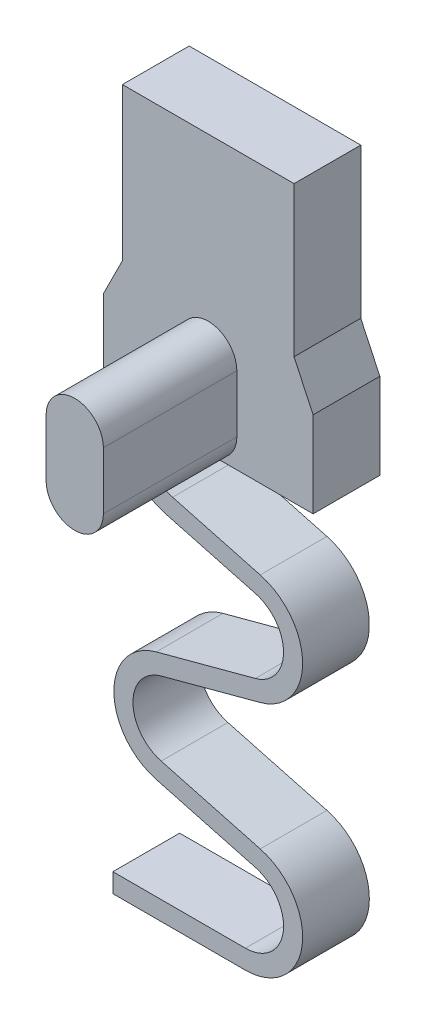
ISO-10303-21;
HEADER;
FILE_DESCRIPTION(('STEP AP214'),'2;1');
FILE_NAME('part.step','',(''),(''),'','','');
FILE_SCHEMA(('AUTOMOTIVE_DESIGN { 1 0 10303 214 1 1 1 1 }'));
ENDSEC;
DATA;
#1=APPLICATION_CONTEXT('core data for automotive mechanical design processes');
#2=APPLICATION_PROTOCOL_DEFINITION('international standard','automotive_design',2000,#1);
#3=PRODUCT_CONTEXT('',#1,'mechanical');
#4=PRODUCT('Part','Part','',(#3));
#5=PRODUCT_RELATED_PRODUCT_CATEGORY('part','',(#4));
#6=PRODUCT_DEFINITION_FORMATION('','',#4);
#7=PRODUCT_DEFINITION_CONTEXT('part definition',#1,'design');
#8=PRODUCT_DEFINITION('design','',#6,#7);
#9=PRODUCT_DEFINITION_SHAPE('','',#8);
#10=(LENGTH_UNIT() NAMED_UNIT(*) SI_UNIT(.MILLI.,.METRE.));
#11=(NAMED_UNIT(*) PLANE_ANGLE_UNIT() SI_UNIT($,.RADIAN.));
#12=(NAMED_UNIT(*) SI_UNIT($,.STERADIAN.) SOLID_ANGLE_UNIT());
#13=UNCERTAINTY_MEASURE_WITH_UNIT(LENGTH_MEASURE(1.E-05),#10,'distance_accuracy_value','');
#14=(GEOMETRIC_REPRESENTATION_CONTEXT(3) GLOBAL_UNCERTAINTY_ASSIGNED_CONTEXT((#13)) GLOBAL_UNIT_ASSIGNED_CONTEXT((#10,
#11,#12)) REPRESENTATION_CONTEXT('',''));
#15=CARTESIAN_POINT('',(0.,0.,0.));
#16=DIRECTION('',(0.,0.,1.));
#17=DIRECTION('',(1.,0.,0.));
#18=AXIS2_PLACEMENT_3D('',#15,#16,#17);
#19=CARTESIAN_POINT('',(8.11763809020503,16.8746171576417,3.5));
#20=DIRECTION('',(-0.258819045102513,-0.96592582628907,0.));
#21=DIRECTION('',(0.965925826289071,-0.258819045102513,0.));
#22=AXIS2_PLACEMENT_3D('',#19,#20,#21);
#23=PLANE('',#22);
#24=DIRECTION('',(-0.96592582628907,0.258819045102513,0.));
#25=VECTOR('',#24,1.);
#26=CARTESIAN_POINT('',(8.11763809020503,16.8746171576417,0.));
#27=LINE('',#26,#25);
#28=CARTESIAN_POINT('',(8.11763809020503,16.8746171576417,0.));
#29=VERTEX_POINT('',#28);
#30=CARTESIAN_POINT('',(3.52152608796797,18.1061416569641,0.));
#31=VERTEX_POINT('',#30);
#32=EDGE_CURVE('E538',#29,#31,#27,.T.);
#33=ORIENTED_EDGE('',*,*,#32,.F.);
#34=DIRECTION('',(0.,0.,-1.));
#35=VECTOR('',#34,1.);
#36=CARTESIAN_POINT('',(8.11763809020503,16.8746171576417,3.5));
#37=LINE('',#36,#35);
#38=CARTESIAN_POINT('',(8.11763809020503,16.8746171576417,3.5));
#39=VERTEX_POINT('',#38);
#40=EDGE_CURVE('E633',#39,#29,#37,.T.);
#41=ORIENTED_EDGE('',*,*,#40,.F.);
#42=DIRECTION('',(-0.96592582628907,0.258819045102513,0.));
#43=VECTOR('',#42,1.);
#44=CARTESIAN_POINT('',(8.11763809020503,16.8746171576417,3.5));
#45=LINE('',#44,#43);
#46=CARTESIAN_POINT('',(3.52152608796797,18.1061416569641,3.5));
#47=VERTEX_POINT('',#46);
#48=EDGE_CURVE('E477',#39,#47,#45,.T.);
#49=ORIENTED_EDGE('',*,*,#48,.T.);
#50=DIRECTION('',(0.,0.,-1.));
#51=VECTOR('',#50,1.);
#52=CARTESIAN_POINT('',(3.52152608796797,18.1061416569641,3.5));
#53=LINE('',#52,#51);
#54=EDGE_CURVE('E358',#47,#31,#53,.T.);
#55=ORIENTED_EDGE('',*,*,#54,.T.);
#56=EDGE_LOOP('',(#33,#41,#49,#55));
#57=FACE_BOUND('',#56,.T.);
#58=ADVANCED_FACE('F94',(#57),#23,.T.);
#59=CARTESIAN_POINT('',(7.59999999999998,14.9427655050636,3.5));
#60=DIRECTION('',(0.,0.,-1.));
#61=DIRECTION('',(-1.,0.,0.));
#62=AXIS2_PLACEMENT_3D('',#59,#60,#61);
#63=CYLINDRICAL_SURFACE('',#62,2.00000000000003);
#64=CARTESIAN_POINT('',(7.59999999999998,14.9427655050636,0.));
#65=DIRECTION('',(0.,0.,1.));
#66=DIRECTION('',(1.,0.,0.));
#67=AXIS2_PLACEMENT_3D('',#64,#65,#66);
#68=CIRCLE('',#67,2.00000000000003);
#69=CARTESIAN_POINT('',(8.11763809020503,13.0109138524854,0.));
#70=VERTEX_POINT('',#69);
#71=EDGE_CURVE('E542',#70,#29,#68,.T.);
#72=ORIENTED_EDGE('',*,*,#71,.F.);
#73=DIRECTION('',(0.,0.,-1.));
#74=VECTOR('',#73,1.);
#75=CARTESIAN_POINT('',(8.11763809020503,13.0109138524854,3.5));
#76=LINE('',#75,#74);
#77=CARTESIAN_POINT('',(8.11763809020503,13.0109138524854,3.5));
#78=VERTEX_POINT('',#77);
#79=EDGE_CURVE('E630',#78,#70,#76,.T.);
#80=ORIENTED_EDGE('',*,*,#79,.F.);
#81=CARTESIAN_POINT('',(7.59999999999998,14.9427655050636,3.5));
#82=DIRECTION('',(0.,0.,1.));
#83=DIRECTION('',(1.,0.,0.));
#84=AXIS2_PLACEMENT_3D('',#81,#82,#83);
#85=CIRCLE('',#84,2.00000000000003);
#86=EDGE_CURVE('E486',#78,#39,#85,.T.);
#87=ORIENTED_EDGE('',*,*,#86,.T.);
#88=ORIENTED_EDGE('',*,*,#40,.T.);
#89=EDGE_LOOP('',(#72,#80,#87,#88));
#90=FACE_BOUND('',#89,.T.);
#91=ADVANCED_FACE('F678',(#90),#63,.F.);
#92=CARTESIAN_POINT('',(2.92354286469244,11.619160231399,3.5));
#93=DIRECTION('',(-0.258819045102522,0.965925826289068,0.));
#94=DIRECTION('',(-0.965925826289068,-0.258819045102522,0.));
#95=AXIS2_PLACEMENT_3D('',#92,#93,#94);
#96=PLANE('',#95);
#97=DIRECTION('',(0.965925826289068,0.258819045102522,0.));
#98=VECTOR('',#97,1.);
#99=CARTESIAN_POINT('',(2.92354286469244,11.619160231399,0.));
#100=LINE('',#99,#98);
#101=CARTESIAN_POINT('',(2.92354286469244,11.619160231399,0.));
#102=VERTEX_POINT('',#101);
#103=EDGE_CURVE('E546',#102,#70,#100,.T.);
#104=ORIENTED_EDGE('',*,*,#103,.F.);
#105=DIRECTION('',(0.,0.,-1.));
#106=VECTOR('',#105,1.);
#107=CARTESIAN_POINT('',(2.92354286469244,11.619160231399,3.5));
#108=LINE('',#107,#106);
#109=CARTESIAN_POINT('',(2.92354286469244,11.619160231399,3.5));
#110=VERTEX_POINT('',#109);
#111=EDGE_CURVE('E627',#110,#102,#108,.T.);
#112=ORIENTED_EDGE('',*,*,#111,.F.);
#113=DIRECTION('',(0.965925826289068,0.258819045102522,0.));
#114=VECTOR('',#113,1.);
#115=CARTESIAN_POINT('',(2.92354286469244,11.619160231399,3.5));
#116=LINE('',#115,#114);
#117=EDGE_CURVE('E489',#110,#78,#116,.T.);
#118=ORIENTED_EDGE('',*,*,#117,.T.);
#119=ORIENTED_EDGE('',*,*,#79,.T.);
#120=EDGE_LOOP('',(#104,#112,#118,#119));
#121=FACE_BOUND('',#120,.T.);
#122=ADVANCED_FACE('F684',(#121),#96,.T.);
#123=CARTESIAN_POINT('',(3.7,8.72138275253176,3.5));
#124=DIRECTION('',(0.,0.,-1.));
#125=DIRECTION('',(-1.,0.,0.));
#126=AXIS2_PLACEMENT_3D('',#123,#124,#125);
#127=CYLINDRICAL_SURFACE('',#126,3.);
#128=CARTESIAN_POINT('',(3.7,8.72138275253176,0.));
#129=DIRECTION('',(0.,0.,1.));
#130=DIRECTION('',(1.,0.,0.));
#131=AXIS2_PLACEMENT_3D('',#128,#129,#130);
#132=CIRCLE('',#131,3.);
#133=CARTESIAN_POINT('',(2.92354286469246,5.82360527366455,0.));
#134=VERTEX_POINT('',#133);
#135=EDGE_CURVE('E550',#134,#102,#132,.F.);
#136=ORIENTED_EDGE('',*,*,#135,.F.);
#137=DIRECTION('',(0.,0.,-1.));
#138=VECTOR('',#137,1.);
#139=CARTESIAN_POINT('',(2.92354286469246,5.82360527366455,3.5));
#140=LINE('',#139,#138);
#141=CARTESIAN_POINT('',(2.92354286469246,5.82360527366455,3.5));
#142=VERTEX_POINT('',#141);
#143=EDGE_CURVE('E624',#142,#134,#140,.T.);
#144=ORIENTED_EDGE('',*,*,#143,.F.);
#145=CARTESIAN_POINT('',(3.7,8.72138275253176,3.5));
#146=DIRECTION('',(0.,0.,1.));
#147=DIRECTION('',(1.,0.,0.));
#148=AXIS2_PLACEMENT_3D('',#145,#146,#147);
#149=CIRCLE('',#148,3.);
#150=EDGE_CURVE('E492',#142,#110,#149,.F.);
#151=ORIENTED_EDGE('',*,*,#150,.T.);
#152=ORIENTED_EDGE('',*,*,#111,.T.);
#153=EDGE_LOOP('',(#136,#144,#151,#152));
#154=FACE_BOUND('',#153,.T.);
#155=ADVANCED_FACE('F810',(#154),#127,.T.);
#156=CARTESIAN_POINT('',(8.11763809020503,4.43185165257814,3.5));
#157=DIRECTION('',(-0.258819045102514,-0.96592582628907,0.));
#158=DIRECTION('',(0.96592582628907,-0.258819045102514,0.));
#159=AXIS2_PLACEMENT_3D('',#156,#157,#158);
#160=PLANE('',#159);
#161=DIRECTION('',(-0.96592582628907,0.258819045102514,0.));
#162=VECTOR('',#161,1.);
#163=CARTESIAN_POINT('',(8.11763809020503,4.43185165257814,0.));
#164=LINE('',#163,#162);
#165=CARTESIAN_POINT('',(8.11763809020503,4.43185165257814,0.));
#166=VERTEX_POINT('',#165);
#167=EDGE_CURVE('E554',#166,#134,#164,.T.);
#168=ORIENTED_EDGE('',*,*,#167,.F.);
#169=DIRECTION('',(0.,0.,-1.));
#170=VECTOR('',#169,1.);
#171=CARTESIAN_POINT('',(8.11763809020503,4.43185165257814,3.5));
#172=LINE('',#171,#170);
#173=CARTESIAN_POINT('',(8.11763809020503,4.43185165257814,3.5));
#174=VERTEX_POINT('',#173);
#175=EDGE_CURVE('E621',#174,#166,#172,.T.);
#176=ORIENTED_EDGE('',*,*,#175,.F.);
#177=DIRECTION('',(-0.96592582628907,0.258819045102514,0.));
#178=VECTOR('',#177,1.);
#179=CARTESIAN_POINT('',(8.11763809020503,4.43185165257814,3.5));
#180=LINE('',#179,#178);
#181=EDGE_CURVE('E496',#174,#142,#180,.T.);
#182=ORIENTED_EDGE('',*,*,#181,.T.);
#183=ORIENTED_EDGE('',*,*,#143,.T.);
#184=EDGE_LOOP('',(#168,#176,#182,#183));
#185=FACE_BOUND('',#184,.T.);
#186=ADVANCED_FACE('F803',(#185),#160,.T.);
#187=CARTESIAN_POINT('',(7.6,2.5,3.5));
#188=DIRECTION('',(0.,0.,-1.));
#189=DIRECTION('',(-1.,0.,0.));
#190=AXIS2_PLACEMENT_3D('',#187,#188,#189);
#191=CYLINDRICAL_SURFACE('',#190,2.);
#192=CARTESIAN_POINT('',(7.6,2.5,0.));
#193=DIRECTION('',(0.,0.,1.));
#194=DIRECTION('',(1.,0.,0.));
#195=AXIS2_PLACEMENT_3D('',#192,#193,#194);
#196=CIRCLE('',#195,2.);
#197=CARTESIAN_POINT('',(7.6,0.5,0.));
#198=VERTEX_POINT('',#197);
#199=EDGE_CURVE('E558',#198,#166,#196,.T.);
#200=ORIENTED_EDGE('',*,*,#199,.F.);
#201=DIRECTION('',(0.,0.,-1.));
#202=VECTOR('',#201,1.);
#203=CARTESIAN_POINT('',(7.6,0.5,3.5));
#204=LINE('',#203,#202);
#205=CARTESIAN_POINT('',(7.6,0.5,3.5));
#206=VERTEX_POINT('',#205);
#207=EDGE_CURVE('E618',#206,#198,#204,.T.);
#208=ORIENTED_EDGE('',*,*,#207,.F.);
#209=CARTESIAN_POINT('',(7.6,2.5,3.5));
#210=DIRECTION('',(0.,0.,1.));
#211=DIRECTION('',(1.,0.,0.));
#212=AXIS2_PLACEMENT_3D('',#209,#210,#211);
#213=CIRCLE('',#212,2.);
#214=EDGE_CURVE('E500',#206,#174,#213,.T.);
#215=ORIENTED_EDGE('',*,*,#214,.T.);
#216=ORIENTED_EDGE('',*,*,#175,.T.);
#217=EDGE_LOOP('',(#200,#208,#215,#216));
#218=FACE_BOUND('',#217,.T.);
#219=ADVANCED_FACE('F796',(#218),#191,.F.);
#220=CARTESIAN_POINT('',(0.65,0.5,3.5));
#221=DIRECTION('',(0.,1.,0.));
#222=DIRECTION('',(0.,0.,1.));
#223=AXIS2_PLACEMENT_3D('',#220,#221,#222);
#224=PLANE('',#223);
#225=DIRECTION('',(1.,0.,0.));
#226=VECTOR('',#225,1.);
#227=CARTESIAN_POINT('',(0.65,0.5,0.));
#228=LINE('',#227,#226);
#229=CARTESIAN_POINT('',(0.65,0.5,0.));
#230=VERTEX_POINT('',#229);
#231=EDGE_CURVE('E562',#230,#198,#228,.T.);
#232=ORIENTED_EDGE('',*,*,#231,.F.);
#233=DIRECTION('',(0.,0.,-1.));
#234=VECTOR('',#233,1.);
#235=CARTESIAN_POINT('',(0.65,0.5,3.5));
#236=LINE('',#235,#234);
#237=CARTESIAN_POINT('',(0.65,0.5,3.5));
#238=VERTEX_POINT('',#237);
#239=EDGE_CURVE('E615',#238,#230,#236,.T.);
#240=ORIENTED_EDGE('',*,*,#239,.F.);
#241=DIRECTION('',(1.,0.,0.));
#242=VECTOR('',#241,1.);
#243=CARTESIAN_POINT('',(0.65,0.5,3.5));
#244=LINE('',#243,#242);
#245=EDGE_CURVE('E504',#238,#206,#244,.T.);
#246=ORIENTED_EDGE('',*,*,#245,.T.);
#247=ORIENTED_EDGE('',*,*,#207,.T.);
#248=EDGE_LOOP('',(#232,#240,#246,#247));
#249=FACE_BOUND('',#248,.T.);
#250=ADVANCED_FACE('F789',(#249),#224,.T.);
#251=CARTESIAN_POINT('',(0.65,-0.5,3.5));
#252=DIRECTION('',(-1.,0.,0.));
#253=DIRECTION('',(0.,0.,1.));
#254=AXIS2_PLACEMENT_3D('',#251,#252,#253);
#255=PLANE('',#254);
#256=DIRECTION('',(0.,1.,0.));
#257=VECTOR('',#256,1.);
#258=CARTESIAN_POINT('',(0.65,-0.5,0.));
#259=LINE('',#258,#257);
#260=CARTESIAN_POINT('',(0.65,-0.5,0.));
#261=VERTEX_POINT('',#260);
#262=EDGE_CURVE('E566',#261,#230,#259,.T.);
#263=ORIENTED_EDGE('',*,*,#262,.F.);
#264=DIRECTION('',(0.,0.,-1.));
#265=VECTOR('',#264,1.);
#266=CARTESIAN_POINT('',(0.65,-0.5,3.5));
#267=LINE('',#266,#265);
#268=CARTESIAN_POINT('',(0.65,-0.5,3.5));
#269=VERTEX_POINT('',#268);
#270=EDGE_CURVE('E612',#269,#261,#267,.T.);
#271=ORIENTED_EDGE('',*,*,#270,.F.);
#272=DIRECTION('',(0.,1.,0.));
#273=VECTOR('',#272,1.);
#274=CARTESIAN_POINT('',(0.65,-0.5,3.5));
#275=LINE('',#274,#273);
#276=EDGE_CURVE('E508',#269,#238,#275,.T.);
#277=ORIENTED_EDGE('',*,*,#276,.T.);
#278=ORIENTED_EDGE('',*,*,#239,.T.);
#279=EDGE_LOOP('',(#263,#271,#277,#278));
#280=FACE_BOUND('',#279,.T.);
#281=ADVANCED_FACE('F782',(#280),#255,.T.);
#282=CARTESIAN_POINT('',(0.65,-0.5,3.5));
#283=DIRECTION('',(0.,1.,0.));
#284=DIRECTION('',(0.,0.,1.));
#285=AXIS2_PLACEMENT_3D('',#282,#283,#284);
#286=PLANE('',#285);
#287=DIRECTION('',(1.,0.,0.));
#288=VECTOR('',#287,1.);
#289=CARTESIAN_POINT('',(0.65,-0.5,0.));
#290=LINE('',#289,#288);
#291=CARTESIAN_POINT('',(7.6,-0.5,0.));
#292=VERTEX_POINT('',#291);
#293=EDGE_CURVE('E570',#261,#292,#290,.T.);
#294=ORIENTED_EDGE('',*,*,#293,.T.);
#295=DIRECTION('',(0.,0.,-1.));
#296=VECTOR('',#295,1.);
#297=CARTESIAN_POINT('',(7.6,-0.5,3.5));
#298=LINE('',#297,#296);
#299=CARTESIAN_POINT('',(7.6,-0.5,3.5));
#300=VERTEX_POINT('',#299);
#301=EDGE_CURVE('E608',#300,#292,#298,.T.);
#302=ORIENTED_EDGE('',*,*,#301,.F.);
#303=DIRECTION('',(1.,0.,0.));
#304=VECTOR('',#303,1.);
#305=CARTESIAN_POINT('',(0.65,-0.5,3.5));
#306=LINE('',#305,#304);
#307=EDGE_CURVE('E512',#269,#300,#306,.T.);
#308=ORIENTED_EDGE('',*,*,#307,.F.);
#309=ORIENTED_EDGE('',*,*,#270,.T.);
#310=EDGE_LOOP('',(#294,#302,#308,#309));
#311=FACE_BOUND('',#310,.T.);
#312=ADVANCED_FACE('F775',(#311),#286,.F.);
#313=CARTESIAN_POINT('',(7.6,2.5,3.5));
#314=DIRECTION('',(0.,0.,-1.));
#315=DIRECTION('',(-1.,0.,0.));
#316=AXIS2_PLACEMENT_3D('',#313,#314,#315);
#317=CYLINDRICAL_SURFACE('',#316,3.);
#318=CARTESIAN_POINT('',(7.6,2.5,0.));
#319=DIRECTION('',(0.,0.,1.));
#320=DIRECTION('',(1.,0.,0.));
#321=AXIS2_PLACEMENT_3D('',#318,#319,#320);
#322=CIRCLE('',#321,3.);
#323=CARTESIAN_POINT('',(8.37645713530755,5.39777747886721,0.));
#324=VERTEX_POINT('',#323);
#325=EDGE_CURVE('E573',#292,#324,#322,.T.);
#326=ORIENTED_EDGE('',*,*,#325,.T.);
#327=DIRECTION('',(0.,0.,-1.));
#328=VECTOR('',#327,1.);
#329=CARTESIAN_POINT('',(8.37645713530755,5.39777747886721,3.5));
#330=LINE('',#329,#328);
#331=CARTESIAN_POINT('',(8.37645713530755,5.39777747886721,3.5));
#332=VERTEX_POINT('',#331);
#333=EDGE_CURVE('E604',#332,#324,#330,.T.);
#334=ORIENTED_EDGE('',*,*,#333,.F.);
#335=CARTESIAN_POINT('',(7.6,2.5,3.5));
#336=DIRECTION('',(0.,0.,1.));
#337=DIRECTION('',(1.,0.,0.));
#338=AXIS2_PLACEMENT_3D('',#335,#336,#337);
#339=CIRCLE('',#338,3.);
#340=EDGE_CURVE('E515',#300,#332,#339,.T.);
#341=ORIENTED_EDGE('',*,*,#340,.F.);
#342=ORIENTED_EDGE('',*,*,#301,.T.);
#343=EDGE_LOOP('',(#326,#334,#341,#342));
#344=FACE_BOUND('',#343,.T.);
#345=ADVANCED_FACE('F768',(#344),#317,.T.);
#346=CARTESIAN_POINT('',(8.37645713530755,5.39777747886721,3.5));
#347=DIRECTION('',(-0.258819045102514,-0.96592582628907,0.));
#348=DIRECTION('',(0.96592582628907,-0.258819045102514,0.));
#349=AXIS2_PLACEMENT_3D('',#346,#347,#348);
#350=PLANE('',#349);
#351=DIRECTION('',(-0.96592582628907,0.258819045102514,0.));
#352=VECTOR('',#351,1.);
#353=CARTESIAN_POINT('',(8.37645713530755,5.39777747886721,0.));
#354=LINE('',#353,#352);
#355=CARTESIAN_POINT('',(3.18236190979497,6.78953109995362,0.));
#356=VERTEX_POINT('',#355);
#357=EDGE_CURVE('E575',#324,#356,#354,.T.);
#358=ORIENTED_EDGE('',*,*,#357,.T.);
#359=DIRECTION('',(0.,0.,-1.));
#360=VECTOR('',#359,1.);
#361=CARTESIAN_POINT('',(3.18236190979497,6.78953109995362,3.5));
#362=LINE('',#361,#360);
#363=CARTESIAN_POINT('',(3.18236190979497,6.78953109995362,3.5));
#364=VERTEX_POINT('',#363);
#365=EDGE_CURVE('E600',#364,#356,#362,.T.);
#366=ORIENTED_EDGE('',*,*,#365,.F.);
#367=DIRECTION('',(-0.96592582628907,0.258819045102514,0.));
#368=VECTOR('',#367,1.);
#369=CARTESIAN_POINT('',(8.37645713530755,5.39777747886721,3.5));
#370=LINE('',#369,#368);
#371=EDGE_CURVE('E518',#332,#364,#370,.T.);
#372=ORIENTED_EDGE('',*,*,#371,.F.);
#373=ORIENTED_EDGE('',*,*,#333,.T.);
#374=EDGE_LOOP('',(#358,#366,#372,#373));
#375=FACE_BOUND('',#374,.T.);
#376=ADVANCED_FACE('F761',(#375),#350,.F.);
#377=CARTESIAN_POINT('',(3.7,8.72138275253176,3.5));
#378=DIRECTION('',(0.,0.,-1.));
#379=DIRECTION('',(-1.,0.,0.));
#380=AXIS2_PLACEMENT_3D('',#377,#378,#379);
#381=CYLINDRICAL_SURFACE('',#380,2.);
#382=CARTESIAN_POINT('',(3.7,8.72138275253176,0.));
#383=DIRECTION('',(0.,0.,1.));
#384=DIRECTION('',(1.,0.,0.));
#385=AXIS2_PLACEMENT_3D('',#382,#383,#384);
#386=CIRCLE('',#385,2.);
#387=CARTESIAN_POINT('',(3.18236190979496,10.6532344051099,0.));
#388=VERTEX_POINT('',#387);
#389=EDGE_CURVE('E578',#356,#388,#386,.F.);
#390=ORIENTED_EDGE('',*,*,#389,.T.);
#391=DIRECTION('',(0.,0.,-1.));
#392=VECTOR('',#391,1.);
#393=CARTESIAN_POINT('',(3.18236190979496,10.6532344051099,3.5));
#394=LINE('',#393,#392);
#395=CARTESIAN_POINT('',(3.18236190979496,10.6532344051099,3.5));
#396=VERTEX_POINT('',#395);
#397=EDGE_CURVE('E596',#396,#388,#394,.T.);
#398=ORIENTED_EDGE('',*,*,#397,.F.);
#399=CARTESIAN_POINT('',(3.7,8.72138275253176,3.5));
#400=DIRECTION('',(0.,0.,1.));
#401=DIRECTION('',(1.,0.,0.));
#402=AXIS2_PLACEMENT_3D('',#399,#400,#401);
#403=CIRCLE('',#402,2.);
#404=EDGE_CURVE('E521',#364,#396,#403,.F.);
#405=ORIENTED_EDGE('',*,*,#404,.F.);
#406=ORIENTED_EDGE('',*,*,#365,.T.);
#407=EDGE_LOOP('',(#390,#398,#405,#406));
#408=FACE_BOUND('',#407,.T.);
#409=ADVANCED_FACE('F754',(#408),#381,.F.);
#410=CARTESIAN_POINT('',(3.18236190979496,10.6532344051099,3.5));
#411=DIRECTION('',(-0.258819045102522,0.965925826289068,0.));
#412=DIRECTION('',(-0.965925826289068,-0.258819045102522,0.));
#413=AXIS2_PLACEMENT_3D('',#410,#411,#412);
#414=PLANE('',#413);
#415=DIRECTION('',(0.965925826289068,0.258819045102522,0.));
#416=VECTOR('',#415,1.);
#417=CARTESIAN_POINT('',(3.18236190979496,10.6532344051099,0.));
#418=LINE('',#417,#416);
#419=CARTESIAN_POINT('',(8.37645713530755,12.0449880261963,0.));
#420=VERTEX_POINT('',#419);
#421=EDGE_CURVE('E581',#388,#420,#418,.T.);
#422=ORIENTED_EDGE('',*,*,#421,.T.);
#423=DIRECTION('',(0.,0.,-1.));
#424=VECTOR('',#423,1.);
#425=CARTESIAN_POINT('',(8.37645713530755,12.0449880261963,3.5));
#426=LINE('',#425,#424);
#427=CARTESIAN_POINT('',(8.37645713530755,12.0449880261963,3.5));
#428=VERTEX_POINT('',#427);
#429=EDGE_CURVE('E592',#428,#420,#426,.T.);
#430=ORIENTED_EDGE('',*,*,#429,.F.);
#431=DIRECTION('',(0.965925826289068,0.258819045102522,0.));
#432=VECTOR('',#431,1.);
#433=CARTESIAN_POINT('',(3.18236190979496,10.6532344051099,3.5));
#434=LINE('',#433,#432);
#435=EDGE_CURVE('E524',#396,#428,#434,.T.);
#436=ORIENTED_EDGE('',*,*,#435,.F.);
#437=ORIENTED_EDGE('',*,*,#397,.T.);
#438=EDGE_LOOP('',(#422,#430,#436,#437));
#439=FACE_BOUND('',#438,.T.);
#440=ADVANCED_FACE('F747',(#439),#414,.F.);
#441=CARTESIAN_POINT('',(7.59999999999998,14.9427655050636,3.5));
#442=DIRECTION('',(0.,0.,-1.));
#443=DIRECTION('',(-1.,0.,0.));
#444=AXIS2_PLACEMENT_3D('',#441,#442,#443);
#445=CYLINDRICAL_SURFACE('',#444,3.00000000000003);
#446=CARTESIAN_POINT('',(7.59999999999998,14.9427655050636,0.));
#447=DIRECTION('',(0.,0.,1.));
#448=DIRECTION('',(1.,0.,0.));
#449=AXIS2_PLACEMENT_3D('',#446,#447,#448);
#450=CIRCLE('',#449,3.00000000000003);
#451=CARTESIAN_POINT('',(8.37645713530754,17.8405429839308,0.));
#452=VERTEX_POINT('',#451);
#453=EDGE_CURVE('E479',#420,#452,#450,.T.);
#454=ORIENTED_EDGE('',*,*,#453,.T.);
#455=DIRECTION('',(0.,0.,-1.));
#456=VECTOR('',#455,1.);
#457=CARTESIAN_POINT('',(8.37645713530754,17.8405429839308,3.5));
#458=LINE('',#457,#456);
#459=CARTESIAN_POINT('',(8.37645713530754,17.8405429839308,3.5));
#460=VERTEX_POINT('',#459);
#461=EDGE_CURVE('E588',#460,#452,#458,.T.);
#462=ORIENTED_EDGE('',*,*,#461,.F.);
#463=CARTESIAN_POINT('',(7.59999999999998,14.9427655050636,3.5));
#464=DIRECTION('',(0.,0.,1.));
#465=DIRECTION('',(1.,0.,0.));
#466=AXIS2_PLACEMENT_3D('',#463,#464,#465);
#467=CIRCLE('',#466,3.00000000000003);
#468=EDGE_CURVE('E527',#428,#460,#467,.T.);
#469=ORIENTED_EDGE('',*,*,#468,.F.);
#470=ORIENTED_EDGE('',*,*,#429,.T.);
#471=EDGE_LOOP('',(#454,#462,#469,#470));
#472=FACE_BOUND('',#471,.T.);
#473=ADVANCED_FACE('F740',(#472),#445,.T.);
#474=CARTESIAN_POINT('',(8.37645713530754,17.8405429839308,3.5));
#475=DIRECTION('',(-0.258819045102513,-0.96592582628907,0.));
#476=DIRECTION('',(0.965925826289071,-0.258819045102513,0.));
#477=AXIS2_PLACEMENT_3D('',#474,#475,#476);
#478=PLANE('',#477);
#479=DIRECTION('',(-0.96592582628907,0.258819045102513,0.));
#480=VECTOR('',#479,1.);
#481=CARTESIAN_POINT('',(8.37645713530754,17.8405429839308,0.));
#482=LINE('',#481,#480);
#483=CARTESIAN_POINT('',(3.78034513307048,19.0720674832532,0.));
#484=VERTEX_POINT('',#483);
#485=EDGE_CURVE('E473',#452,#484,#482,.T.);
#486=ORIENTED_EDGE('',*,*,#485,.T.);
#487=DIRECTION('',(0.,0.,-1.));
#488=VECTOR('',#487,1.);
#489=CARTESIAN_POINT('',(3.78034513307048,19.0720674832532,3.5));
#490=LINE('',#489,#488);
#491=CARTESIAN_POINT('',(3.78034513307048,19.0720674832532,3.5));
#492=VERTEX_POINT('',#491);
#493=EDGE_CURVE('E532',#492,#484,#490,.T.);
#494=ORIENTED_EDGE('',*,*,#493,.F.);
#495=DIRECTION('',(-0.96592582628907,0.258819045102513,0.));
#496=VECTOR('',#495,1.);
#497=CARTESIAN_POINT('',(8.37645713530754,17.8405429839308,3.5));
#498=LINE('',#497,#496);
#499=EDGE_CURVE('E469',#460,#492,#498,.T.);
#500=ORIENTED_EDGE('',*,*,#499,.F.);
#501=ORIENTED_EDGE('',*,*,#461,.T.);
#502=EDGE_LOOP('',(#486,#494,#500,#501));
#503=FACE_BOUND('',#502,.T.);
#504=ADVANCED_FACE('F696',(#503),#478,.F.);
#505=CARTESIAN_POINT('',(4.69885688264115,22.5,3.5));
#506=DIRECTION('',(0.,0.,-1.));
#507=DIRECTION('',(-1.,0.,0.));
#508=AXIS2_PLACEMENT_3D('',#505,#506,#507);
#509=CYLINDRICAL_SURFACE('',#508,3.54885688264116);
#510=CARTESIAN_POINT('',(4.69885688264115,22.5,0.));
#511=DIRECTION('',(0.,0.,1.));
#512=DIRECTION('',(1.,0.,0.));
#513=AXIS2_PLACEMENT_3D('',#510,#511,#512);
#514=CIRCLE('',#513,3.54885688264116);
#515=CARTESIAN_POINT('',(1.18539915933359,22.,0.));
#516=VERTEX_POINT('',#515);
#517=EDGE_CURVE('E350',#484,#516,#514,.F.);
#518=ORIENTED_EDGE('',*,*,#517,.T.);
#519=DIRECTION('',(0.,0.,-1.));
#520=VECTOR('',#519,1.);
#521=CARTESIAN_POINT('',(1.18539915933359,22.,3.5));
#522=LINE('',#521,#520);
#523=CARTESIAN_POINT('',(1.18539915933359,22.,3.5));
#524=VERTEX_POINT('',#523);
#525=EDGE_CURVE('E357',#516,#524,#522,.F.);
#526=ORIENTED_EDGE('',*,*,#525,.T.);
#527=CARTESIAN_POINT('',(4.69885688264115,22.5,3.5));
#528=DIRECTION('',(0.,0.,1.));
#529=DIRECTION('',(1.,0.,0.));
#530=AXIS2_PLACEMENT_3D('',#527,#528,#529);
#531=CIRCLE('',#530,3.54885688264116);
#532=EDGE_CURVE('E467',#492,#524,#531,.F.);
#533=ORIENTED_EDGE('',*,*,#532,.F.);
#534=ORIENTED_EDGE('',*,*,#493,.T.);
#535=EDGE_LOOP('',(#518,#526,#533,#534));
#536=FACE_BOUND('',#535,.T.);
#537=ADVANCED_FACE('F465',(#536),#509,.F.);
#538=CARTESIAN_POINT('',(4.69885688264115,22.5,3.5));
#539=DIRECTION('',(0.,0.,-1.));
#540=DIRECTION('',(-1.,0.,0.));
#541=AXIS2_PLACEMENT_3D('',#538,#539,#540);
#542=CYLINDRICAL_SURFACE('',#541,4.54885688264116);
#543=DIRECTION('',(0.,0.,-1.));
#544=VECTOR('',#543,1.);
#545=CARTESIAN_POINT('',(0.177562937457775,22.,3.5));
#546=LINE('',#545,#544);
#547=CARTESIAN_POINT('',(0.177562937457775,22.,0.));
#548=VERTEX_POINT('',#547);
#549=CARTESIAN_POINT('',(0.177562937457775,22.,3.5));
#550=VERTEX_POINT('',#549);
#551=EDGE_CURVE('E354',#548,#550,#546,.F.);
#552=ORIENTED_EDGE('',*,*,#551,.F.);
#553=CARTESIAN_POINT('',(4.69885688264115,22.5,0.));
#554=DIRECTION('',(0.,0.,1.));
#555=DIRECTION('',(1.,0.,0.));
#556=AXIS2_PLACEMENT_3D('',#553,#554,#555);
#557=CIRCLE('',#556,4.54885688264116);
#558=EDGE_CURVE('E535',#31,#548,#557,.F.);
#559=ORIENTED_EDGE('',*,*,#558,.F.);
#560=ORIENTED_EDGE('',*,*,#54,.F.);
#561=CARTESIAN_POINT('',(4.69885688264115,22.5,3.5));
#562=DIRECTION('',(0.,0.,1.));
#563=DIRECTION('',(1.,0.,0.));
#564=AXIS2_PLACEMENT_3D('',#561,#562,#563);
#565=CIRCLE('',#564,4.54885688264116);
#566=EDGE_CURVE('E472',#47,#550,#565,.F.);
#567=ORIENTED_EDGE('',*,*,#566,.T.);
#568=EDGE_LOOP('',(#552,#559,#560,#567));
#569=FACE_BOUND('',#568,.T.);
#570=ADVANCED_FACE('F690',(#569),#542,.T.);
#571=CARTESIAN_POINT('',(4.69885688264115,22.5,0.));
#572=DIRECTION('',(0.,0.,1.));
#573=DIRECTION('',(1.,0.,0.));
#574=AXIS2_PLACEMENT_3D('',#571,#572,#573);
#575=PLANE('',#574);
#576=DIRECTION('',(0.,-1.,0.));
#577=VECTOR('',#576,1.);
#578=CARTESIAN_POINT('',(10.15,36.7,0.));
#579=LINE('',#578,#577);
#580=CARTESIAN_POINT('',(10.15,36.5,0.));
#581=VERTEX_POINT('',#580);
#582=CARTESIAN_POINT('',(10.15,28.636121044429,0.));
#583=VERTEX_POINT('',#582);
#584=EDGE_CURVE('E118',#581,#583,#579,.T.);
#585=ORIENTED_EDGE('',*,*,#584,.T.);
#586=DIRECTION('',(0.423979597315796,-0.905671740234802,0.));
#587=VECTOR('',#586,1.);
#588=CARTESIAN_POINT('',(10.15,28.636121044429,0.));
#589=LINE('',#588,#587);
#590=CARTESIAN_POINT('',(11.15,26.5,0.));
#591=VERTEX_POINT('',#590);
#592=EDGE_CURVE('E315',#583,#591,#589,.T.);
#593=ORIENTED_EDGE('',*,*,#592,.T.);
#594=DIRECTION('',(0.,1.,0.));
#595=VECTOR('',#594,1.);
#596=CARTESIAN_POINT('',(11.15,0.,0.));
#597=LINE('',#596,#595);
#598=CARTESIAN_POINT('',(11.15,22.,0.));
#599=VERTEX_POINT('',#598);
#600=EDGE_CURVE('E330',#599,#591,#597,.T.);
#601=ORIENTED_EDGE('',*,*,#600,.F.);
#602=DIRECTION('',(-1.,0.,0.));
#603=VECTOR('',#602,1.);
#604=CARTESIAN_POINT('',(0.,22.,0.));
#605=LINE('',#604,#603);
#606=EDGE_CURVE('E343',#599,#516,#605,.T.);
#607=ORIENTED_EDGE('',*,*,#606,.T.);
#608=ORIENTED_EDGE('',*,*,#517,.F.);
#609=ORIENTED_EDGE('',*,*,#485,.F.);
#610=ORIENTED_EDGE('',*,*,#453,.F.);
#611=ORIENTED_EDGE('',*,*,#421,.F.);
#612=ORIENTED_EDGE('',*,*,#389,.F.);
#613=ORIENTED_EDGE('',*,*,#357,.F.);
#614=ORIENTED_EDGE('',*,*,#325,.F.);
#615=ORIENTED_EDGE('',*,*,#293,.F.);
#616=ORIENTED_EDGE('',*,*,#262,.T.);
#617=ORIENTED_EDGE('',*,*,#231,.T.);
#618=ORIENTED_EDGE('',*,*,#199,.T.);
#619=ORIENTED_EDGE('',*,*,#167,.T.);
#620=ORIENTED_EDGE('',*,*,#135,.T.);
#621=ORIENTED_EDGE('',*,*,#103,.T.);
#622=ORIENTED_EDGE('',*,*,#71,.T.);
#623=ORIENTED_EDGE('',*,*,#32,.T.);
#624=ORIENTED_EDGE('',*,*,#558,.T.);
#625=CARTESIAN_POINT('',(0.149999999999996,22.,0.));
#626=VERTEX_POINT('',#625);
#627=EDGE_CURVE('E320',#548,#626,#605,.T.);
#628=ORIENTED_EDGE('',*,*,#627,.T.);
#629=DIRECTION('',(0.,1.,0.));
#630=VECTOR('',#629,1.);
#631=CARTESIAN_POINT('',(0.149999999999993,0.,0.));
#632=LINE('',#631,#630);
#633=CARTESIAN_POINT('',(0.149999999999996,26.5,0.));
#634=VERTEX_POINT('',#633);
#635=EDGE_CURVE('E311',#626,#634,#632,.T.);
#636=ORIENTED_EDGE('',*,*,#635,.T.);
#637=DIRECTION('',(0.447213595499959,0.894427190999915,0.));
#638=VECTOR('',#637,1.);
#639=CARTESIAN_POINT('',(0.149999999999996,26.5,0.));
#640=LINE('',#639,#638);
#641=CARTESIAN_POINT('',(1.15,28.5,0.));
#642=VERTEX_POINT('',#641);
#643=EDGE_CURVE('E294',#634,#642,#640,.T.);
#644=ORIENTED_EDGE('',*,*,#643,.T.);
#645=DIRECTION('',(0.,1.,0.));
#646=VECTOR('',#645,1.);
#647=CARTESIAN_POINT('',(1.15,28.5,0.));
#648=LINE('',#647,#646);
#649=CARTESIAN_POINT('',(1.15,36.5,0.));
#650=VERTEX_POINT('',#649);
#651=EDGE_CURVE('E305',#642,#650,#648,.T.);
#652=ORIENTED_EDGE('',*,*,#651,.T.);
#653=DIRECTION('',(-1.,0.,0.));
#654=VECTOR('',#653,1.);
#655=CARTESIAN_POINT('',(0.,36.5,0.));
#656=LINE('',#655,#654);
#657=EDGE_CURVE('E323',#581,#650,#656,.T.);
#658=ORIENTED_EDGE('',*,*,#657,.F.);
#659=EDGE_LOOP('',(#585,#593,#601,#607,#608,#609,#610,#611,#612,#613,#614,#615,#616,#617,#618,
#619,#620,#621,#622,#623,#624,#628,#636,#644,#652,#658));
#660=FACE_BOUND('',#659,.T.);
#661=ADVANCED_FACE('F317',(#660),#575,.F.);
#662=CARTESIAN_POINT('',(4.69885688264115,22.5,3.5));
#663=DIRECTION('',(0.,0.,1.));
#664=DIRECTION('',(1.,0.,0.));
#665=AXIS2_PLACEMENT_3D('',#662,#663,#664);
#666=PLANE('',#665);
#667=DIRECTION('',(0.423979597315796,-0.905671740234802,0.));
#668=VECTOR('',#667,1.);
#669=CARTESIAN_POINT('',(11.5262962654476,25.6961856284373,3.5));
#670=LINE('',#669,#668);
#671=CARTESIAN_POINT('',(10.15,28.636121044429,3.5));
#672=VERTEX_POINT('',#671);
#673=CARTESIAN_POINT('',(11.15,26.5,3.5));
#674=VERTEX_POINT('',#673);
#675=EDGE_CURVE('E413',#672,#674,#670,.T.);
#676=ORIENTED_EDGE('',*,*,#675,.F.);
#677=DIRECTION('',(0.,-1.,0.));
#678=VECTOR('',#677,1.);
#679=CARTESIAN_POINT('',(10.15,22.5,3.5));
#680=LINE('',#679,#678);
#681=CARTESIAN_POINT('',(10.15,36.5,3.5));
#682=VERTEX_POINT('',#681);
#683=EDGE_CURVE('E416',#682,#672,#680,.T.);
#684=ORIENTED_EDGE('',*,*,#683,.F.);
#685=DIRECTION('',(-1.,0.,0.));
#686=VECTOR('',#685,1.);
#687=CARTESIAN_POINT('',(0.,36.5,3.5));
#688=LINE('',#687,#686);
#689=CARTESIAN_POINT('',(1.15,36.5,3.5));
#690=VERTEX_POINT('',#689);
#691=EDGE_CURVE('E438',#682,#690,#688,.T.);
#692=ORIENTED_EDGE('',*,*,#691,.T.);
#693=DIRECTION('',(0.,1.,0.));
#694=VECTOR('',#693,1.);
#695=CARTESIAN_POINT('',(1.15,22.5,3.5));
#696=LINE('',#695,#694);
#697=CARTESIAN_POINT('',(1.15,28.5,3.5));
#698=VERTEX_POINT('',#697);
#699=EDGE_CURVE('E110',#698,#690,#696,.T.);
#700=ORIENTED_EDGE('',*,*,#699,.F.);
#701=DIRECTION('',(0.447213595499959,0.894427190999915,0.));
#702=VECTOR('',#701,1.);
#703=CARTESIAN_POINT('',(-0.540228623471774,25.1195427530565,3.5));
#704=LINE('',#703,#702);
#705=CARTESIAN_POINT('',(0.149999999999996,26.5,3.5));
#706=VERTEX_POINT('',#705);
#707=EDGE_CURVE('E396',#706,#698,#704,.T.);
#708=ORIENTED_EDGE('',*,*,#707,.F.);
#709=DIRECTION('',(0.,1.,0.));
#710=VECTOR('',#709,1.);
#711=CARTESIAN_POINT('',(0.149999999999993,0.,3.5));
#712=LINE('',#711,#710);
#713=CARTESIAN_POINT('',(0.149999999999996,22.,3.5));
#714=VERTEX_POINT('',#713);
#715=EDGE_CURVE('E313',#714,#706,#712,.T.);
#716=ORIENTED_EDGE('',*,*,#715,.F.);
#717=DIRECTION('',(-1.,0.,0.));
#718=VECTOR('',#717,1.);
#719=CARTESIAN_POINT('',(0.,22.,3.5));
#720=LINE('',#719,#718);
#721=EDGE_CURVE('E642',#550,#714,#720,.T.);
#722=ORIENTED_EDGE('',*,*,#721,.F.);
#723=ORIENTED_EDGE('',*,*,#566,.F.);
#724=ORIENTED_EDGE('',*,*,#48,.F.);
#725=ORIENTED_EDGE('',*,*,#86,.F.);
#726=ORIENTED_EDGE('',*,*,#117,.F.);
#727=ORIENTED_EDGE('',*,*,#150,.F.);
#728=ORIENTED_EDGE('',*,*,#181,.F.);
#729=ORIENTED_EDGE('',*,*,#214,.F.);
#730=ORIENTED_EDGE('',*,*,#245,.F.);
#731=ORIENTED_EDGE('',*,*,#276,.F.);
#732=ORIENTED_EDGE('',*,*,#307,.T.);
#733=ORIENTED_EDGE('',*,*,#340,.T.);
#734=ORIENTED_EDGE('',*,*,#371,.T.);
#735=ORIENTED_EDGE('',*,*,#404,.T.);
#736=ORIENTED_EDGE('',*,*,#435,.T.);
#737=ORIENTED_EDGE('',*,*,#468,.T.);
#738=ORIENTED_EDGE('',*,*,#499,.T.);
#739=ORIENTED_EDGE('',*,*,#532,.T.);
#740=CARTESIAN_POINT('',(5.65,22.,3.5));
#741=VERTEX_POINT('',#740);
#742=EDGE_CURVE('E461',#741,#524,#720,.T.);
#743=ORIENTED_EDGE('',*,*,#742,.F.);
#744=CARTESIAN_POINT('',(5.65,23.5,3.5));
#745=DIRECTION('',(0.,0.,1.));
#746=DIRECTION('',(1.,0.,0.));
#747=AXIS2_PLACEMENT_3D('',#744,#745,#746);
#748=CIRCLE('',#747,1.5);
#749=CARTESIAN_POINT('',(4.15,23.5,3.5));
#750=VERTEX_POINT('',#749);
#751=EDGE_CURVE('E370',#750,#741,#748,.T.);
#752=ORIENTED_EDGE('',*,*,#751,.F.);
#753=DIRECTION('',(0.,-1.,0.));
#754=VECTOR('',#753,1.);
#755=CARTESIAN_POINT('',(4.15,26.5,3.5));
#756=LINE('',#755,#754);
#757=CARTESIAN_POINT('',(4.15,26.5,3.5));
#758=VERTEX_POINT('',#757);
#759=EDGE_CURVE('E380',#758,#750,#756,.T.);
#760=ORIENTED_EDGE('',*,*,#759,.F.);
#761=CARTESIAN_POINT('',(5.65,26.5,3.5));
#762=DIRECTION('',(0.,0.,1.));
#763=DIRECTION('',(1.,0.,0.));
#764=AXIS2_PLACEMENT_3D('',#761,#762,#763);
#765=CIRCLE('',#764,1.5);
#766=CARTESIAN_POINT('',(7.15,26.5,3.5));
#767=VERTEX_POINT('',#766);
#768=EDGE_CURVE('E389',#767,#758,#765,.T.);
#769=ORIENTED_EDGE('',*,*,#768,.F.);
#770=DIRECTION('',(0.,1.,0.));
#771=VECTOR('',#770,1.);
#772=CARTESIAN_POINT('',(7.15,26.5,3.5));
#773=LINE('',#772,#771);
#774=CARTESIAN_POINT('',(7.15,23.5,3.5));
#775=VERTEX_POINT('',#774);
#776=EDGE_CURVE('E379',#775,#767,#773,.T.);
#777=ORIENTED_EDGE('',*,*,#776,.F.);
#778=EDGE_CURVE('E360',#741,#775,#748,.T.);
#779=ORIENTED_EDGE('',*,*,#778,.F.);
#780=CARTESIAN_POINT('',(11.15,22.,3.5));
#781=VERTEX_POINT('',#780);
#782=EDGE_CURVE('E337',#781,#741,#720,.T.);
#783=ORIENTED_EDGE('',*,*,#782,.F.);
#784=DIRECTION('',(0.,1.,0.));
#785=VECTOR('',#784,1.);
#786=CARTESIAN_POINT('',(11.15,0.,3.5));
#787=LINE('',#786,#785);
#788=EDGE_CURVE('E447',#781,#674,#787,.T.);
#789=ORIENTED_EDGE('',*,*,#788,.T.);
#790=EDGE_LOOP('',(#676,#684,#692,#700,#708,#716,#722,#723,#724,#725,#726,#727,#728,#729,#730,
#731,#732,#733,#734,#735,#736,#737,#738,#739,#743,#752,#760,#769,#777,#779,#783,#789));
#791=FACE_BOUND('',#790,.T.);
#792=ADVANCED_FACE('F443',(#791),#666,.T.);
#793=CARTESIAN_POINT('',(0.149999999999993,0.,3.5));
#794=DIRECTION('',(-1.,0.,0.));
#795=DIRECTION('',(0.,-1.,0.));
#796=AXIS2_PLACEMENT_3D('',#793,#794,#795);
#797=PLANE('',#796);
#798=DIRECTION('',(0.,0.,1.));
#799=VECTOR('',#798,1.);
#800=CARTESIAN_POINT('',(0.149999999999996,26.5,0.));
#801=LINE('',#800,#799);
#802=EDGE_CURVE('E297',#634,#706,#801,.T.);
#803=ORIENTED_EDGE('',*,*,#802,.F.);
#804=ORIENTED_EDGE('',*,*,#635,.F.);
#805=DIRECTION('',(0.,0.,-1.));
#806=VECTOR('',#805,1.);
#807=CARTESIAN_POINT('',(0.149999999999996,22.,3.5));
#808=LINE('',#807,#806);
#809=EDGE_CURVE('E347',#714,#626,#808,.T.);
#810=ORIENTED_EDGE('',*,*,#809,.F.);
#811=ORIENTED_EDGE('',*,*,#715,.T.);
#812=EDGE_LOOP('',(#803,#804,#810,#811));
#813=FACE_BOUND('',#812,.T.);
#814=ADVANCED_FACE('F96',(#813),#797,.T.);
#815=CARTESIAN_POINT('',(0.,22.,3.5));
#816=DIRECTION('',(0.,-1.,0.));
#817=DIRECTION('',(1.,0.,0.));
#818=AXIS2_PLACEMENT_3D('',#815,#816,#817);
#819=PLANE('',#818);
#820=ORIENTED_EDGE('',*,*,#627,.F.);
#821=ORIENTED_EDGE('',*,*,#551,.T.);
#822=ORIENTED_EDGE('',*,*,#721,.T.);
#823=ORIENTED_EDGE('',*,*,#809,.T.);
#824=EDGE_LOOP('',(#820,#821,#822,#823));
#825=FACE_BOUND('',#824,.T.);
#826=ADVANCED_FACE('F697',(#825),#819,.T.);
#827=CARTESIAN_POINT('',(11.15,0.,3.5));
#828=DIRECTION('',(-1.,0.,0.));
#829=DIRECTION('',(0.,-1.,0.));
#830=AXIS2_PLACEMENT_3D('',#827,#828,#829);
#831=PLANE('',#830);
#832=ORIENTED_EDGE('',*,*,#600,.T.);
#833=DIRECTION('',(0.,0.,1.));
#834=VECTOR('',#833,1.);
#835=CARTESIAN_POINT('',(11.15,26.5,0.));
#836=LINE('',#835,#834);
#837=EDGE_CURVE('E419',#591,#674,#836,.T.);
#838=ORIENTED_EDGE('',*,*,#837,.T.);
#839=ORIENTED_EDGE('',*,*,#788,.F.);
#840=DIRECTION('',(0.,0.,-1.));
#841=VECTOR('',#840,1.);
#842=CARTESIAN_POINT('',(11.15,22.,3.5));
#843=LINE('',#842,#841);
#844=EDGE_CURVE('E351',#781,#599,#843,.T.);
#845=ORIENTED_EDGE('',*,*,#844,.T.);
#846=EDGE_LOOP('',(#832,#838,#839,#845));
#847=FACE_BOUND('',#846,.T.);
#848=ADVANCED_FACE('F452',(#847),#831,.F.);
#849=ORIENTED_EDGE('',*,*,#525,.F.);
#850=ORIENTED_EDGE('',*,*,#606,.F.);
#851=ORIENTED_EDGE('',*,*,#844,.F.);
#852=ORIENTED_EDGE('',*,*,#782,.T.);
#853=ORIENTED_EDGE('',*,*,#742,.T.);
#854=EDGE_LOOP('',(#849,#850,#851,#852,#853));
#855=FACE_BOUND('',#854,.T.);
#856=ADVANCED_FACE('F458',(#855),#819,.T.);
#857=CARTESIAN_POINT('',(0.,36.5,3.5));
#858=DIRECTION('',(0.,-1.,0.));
#859=DIRECTION('',(0.,0.,-1.));
#860=AXIS2_PLACEMENT_3D('',#857,#858,#859);
#861=PLANE('',#860);
#862=ORIENTED_EDGE('',*,*,#691,.F.);
#863=DIRECTION('',(0.,0.,-1.));
#864=VECTOR('',#863,1.);
#865=CARTESIAN_POINT('',(10.15,36.5,3.5));
#866=LINE('',#865,#864);
#867=EDGE_CURVE('E12',#682,#581,#866,.T.);
#868=ORIENTED_EDGE('',*,*,#867,.T.);
#869=ORIENTED_EDGE('',*,*,#657,.T.);
#870=DIRECTION('',(0.,0.,1.));
#871=VECTOR('',#870,1.);
#872=CARTESIAN_POINT('',(1.15,36.5,3.5));
#873=LINE('',#872,#871);
#874=EDGE_CURVE('E103',#650,#690,#873,.T.);
#875=ORIENTED_EDGE('',*,*,#874,.T.);
#876=EDGE_LOOP('',(#862,#868,#869,#875));
#877=FACE_BOUND('',#876,.T.);
#878=ADVANCED_FACE('F437',(#877),#861,.F.);
#879=CARTESIAN_POINT('',(5.65,26.5,10.5));
#880=DIRECTION('',(0.,0.,-1.));
#881=DIRECTION('',(-1.,0.,0.));
#882=AXIS2_PLACEMENT_3D('',#879,#880,#881);
#883=CYLINDRICAL_SURFACE('',#882,1.5);
#884=ORIENTED_EDGE('',*,*,#768,.T.);
#885=DIRECTION('',(0.,0.,-1.));
#886=VECTOR('',#885,1.);
#887=CARTESIAN_POINT('',(4.15,26.5,10.5));
#888=LINE('',#887,#886);
#889=CARTESIAN_POINT('',(4.15,26.5,10.5));
#890=VERTEX_POINT('',#889);
#891=EDGE_CURVE('E324',#890,#758,#888,.T.);
#892=ORIENTED_EDGE('',*,*,#891,.F.);
#893=CARTESIAN_POINT('',(5.65,26.5,10.5));
#894=DIRECTION('',(0.,0.,1.));
#895=DIRECTION('',(1.,0.,0.));
#896=AXIS2_PLACEMENT_3D('',#893,#894,#895);
#897=CIRCLE('',#896,1.5);
#898=CARTESIAN_POINT('',(7.15,26.5,10.5));
#899=VERTEX_POINT('',#898);
#900=EDGE_CURVE('E386',#899,#890,#897,.T.);
#901=ORIENTED_EDGE('',*,*,#900,.F.);
#902=DIRECTION('',(0.,0.,-1.));
#903=VECTOR('',#902,1.);
#904=CARTESIAN_POINT('',(7.15,26.5,10.5));
#905=LINE('',#904,#903);
#906=EDGE_CURVE('E402',#899,#767,#905,.T.);
#907=ORIENTED_EDGE('',*,*,#906,.T.);
#908=EDGE_LOOP('',(#884,#892,#901,#907));
#909=FACE_BOUND('',#908,.T.);
#910=ADVANCED_FACE('F656',(#909),#883,.T.);
#911=CARTESIAN_POINT('',(4.15,26.5,10.5));
#912=DIRECTION('',(1.,0.,0.));
#913=DIRECTION('',(0.,1.,0.));
#914=AXIS2_PLACEMENT_3D('',#911,#912,#913);
#915=PLANE('',#914);
#916=ORIENTED_EDGE('',*,*,#759,.T.);
#917=DIRECTION('',(0.,0.,-1.));
#918=VECTOR('',#917,1.);
#919=CARTESIAN_POINT('',(4.15,23.5,10.5));
#920=LINE('',#919,#918);
#921=CARTESIAN_POINT('',(4.15,23.5,10.5));
#922=VERTEX_POINT('',#921);
#923=EDGE_CURVE('E334',#922,#750,#920,.T.);
#924=ORIENTED_EDGE('',*,*,#923,.F.);
#925=DIRECTION('',(0.,-1.,0.));
#926=VECTOR('',#925,1.);
#927=CARTESIAN_POINT('',(4.15,26.5,10.5));
#928=LINE('',#927,#926);
#929=EDGE_CURVE('E406',#890,#922,#928,.T.);
#930=ORIENTED_EDGE('',*,*,#929,.F.);
#931=ORIENTED_EDGE('',*,*,#891,.T.);
#932=EDGE_LOOP('',(#916,#924,#930,#931));
#933=FACE_BOUND('',#932,.T.);
#934=ADVANCED_FACE('F664',(#933),#915,.F.);
#935=CARTESIAN_POINT('',(5.65,23.5,10.5));
#936=DIRECTION('',(0.,0.,-1.));
#937=DIRECTION('',(-1.,0.,0.));
#938=AXIS2_PLACEMENT_3D('',#935,#936,#937);
#939=CYLINDRICAL_SURFACE('',#938,1.5);
#940=ORIENTED_EDGE('',*,*,#751,.T.);
#941=ORIENTED_EDGE('',*,*,#778,.T.);
#942=DIRECTION('',(0.,0.,-1.));
#943=VECTOR('',#942,1.);
#944=CARTESIAN_POINT('',(7.15,23.5,10.5));
#945=LINE('',#944,#943);
#946=CARTESIAN_POINT('',(7.15,23.5,10.5));
#947=VERTEX_POINT('',#946);
#948=EDGE_CURVE('E654',#947,#775,#945,.T.);
#949=ORIENTED_EDGE('',*,*,#948,.F.);
#950=CARTESIAN_POINT('',(5.65,23.5,10.5));
#951=DIRECTION('',(0.,0.,1.));
#952=DIRECTION('',(1.,0.,0.));
#953=AXIS2_PLACEMENT_3D('',#950,#951,#952);
#954=CIRCLE('',#953,1.5);
#955=EDGE_CURVE('E403',#922,#947,#954,.T.);
#956=ORIENTED_EDGE('',*,*,#955,.F.);
#957=ORIENTED_EDGE('',*,*,#923,.T.);
#958=EDGE_LOOP('',(#940,#941,#949,#956,#957));
#959=FACE_BOUND('',#958,.T.);
#960=ADVANCED_FACE('F663',(#959),#939,.T.);
#961=CARTESIAN_POINT('',(7.15,26.5,10.5));
#962=DIRECTION('',(-1.,0.,0.));
#963=DIRECTION('',(0.,0.,1.));
#964=AXIS2_PLACEMENT_3D('',#961,#962,#963);
#965=PLANE('',#964);
#966=ORIENTED_EDGE('',*,*,#776,.T.);
#967=ORIENTED_EDGE('',*,*,#906,.F.);
#968=DIRECTION('',(0.,1.,0.));
#969=VECTOR('',#968,1.);
#970=CARTESIAN_POINT('',(7.15,26.5,10.5));
#971=LINE('',#970,#969);
#972=EDGE_CURVE('E399',#947,#899,#971,.T.);
#973=ORIENTED_EDGE('',*,*,#972,.F.);
#974=ORIENTED_EDGE('',*,*,#948,.T.);
#975=EDGE_LOOP('',(#966,#967,#973,#974));
#976=FACE_BOUND('',#975,.T.);
#977=ADVANCED_FACE('F651',(#976),#965,.F.);
#978=CARTESIAN_POINT('',(5.65,26.5,10.5));
#979=DIRECTION('',(0.,0.,1.));
#980=DIRECTION('',(1.,0.,0.));
#981=AXIS2_PLACEMENT_3D('',#978,#979,#980);
#982=PLANE('',#981);
#983=ORIENTED_EDGE('',*,*,#900,.T.);
#984=ORIENTED_EDGE('',*,*,#929,.T.);
#985=ORIENTED_EDGE('',*,*,#955,.T.);
#986=ORIENTED_EDGE('',*,*,#972,.T.);
#987=EDGE_LOOP('',(#983,#984,#985,#986));
#988=FACE_BOUND('',#987,.T.);
#989=ADVANCED_FACE('F666',(#988),#982,.T.);
#990=CARTESIAN_POINT('',(1.15,28.5,0.));
#991=DIRECTION('',(1.,0.,0.));
#992=DIRECTION('',(0.,1.,0.));
#993=AXIS2_PLACEMENT_3D('',#990,#991,#992);
#994=PLANE('',#993);
#995=ORIENTED_EDGE('',*,*,#699,.T.);
#996=ORIENTED_EDGE('',*,*,#874,.F.);
#997=ORIENTED_EDGE('',*,*,#651,.F.);
#998=DIRECTION('',(0.,0.,1.));
#999=VECTOR('',#998,1.);
#1000=CARTESIAN_POINT('',(1.15,28.5,0.));
#1001=LINE('',#1000,#999);
#1002=EDGE_CURVE('E299',#642,#698,#1001,.T.);
#1003=ORIENTED_EDGE('',*,*,#1002,.T.);
#1004=EDGE_LOOP('',(#995,#996,#997,#1003));
#1005=FACE_BOUND('',#1004,.T.);
#1006=ADVANCED_FACE('F668',(#1005),#994,.F.);
#1007=CARTESIAN_POINT('',(0.149999999999996,26.5,0.));
#1008=DIRECTION('',(0.894427190999915,-0.447213595499959,0.));
#1009=DIRECTION('',(0.447213595499959,0.894427190999915,0.));
#1010=AXIS2_PLACEMENT_3D('',#1007,#1008,#1009);
#1011=PLANE('',#1010);
#1012=ORIENTED_EDGE('',*,*,#707,.T.);
#1013=ORIENTED_EDGE('',*,*,#1002,.F.);
#1014=ORIENTED_EDGE('',*,*,#643,.F.);
#1015=ORIENTED_EDGE('',*,*,#802,.T.);
#1016=EDGE_LOOP('',(#1012,#1013,#1014,#1015));
#1017=FACE_BOUND('',#1016,.T.);
#1018=ADVANCED_FACE('F296',(#1017),#1011,.F.);
#1019=CARTESIAN_POINT('',(10.15,28.636121044429,0.));
#1020=DIRECTION('',(-0.905671740234802,-0.423979597315796,0.));
#1021=DIRECTION('',(0.423979597315796,-0.905671740234802,0.));
#1022=AXIS2_PLACEMENT_3D('',#1019,#1020,#1021);
#1023=PLANE('',#1022);
#1024=ORIENTED_EDGE('',*,*,#675,.T.);
#1025=ORIENTED_EDGE('',*,*,#837,.F.);
#1026=ORIENTED_EDGE('',*,*,#592,.F.);
#1027=DIRECTION('',(0.,0.,1.));
#1028=VECTOR('',#1027,1.);
#1029=CARTESIAN_POINT('',(10.15,28.636121044429,0.));
#1030=LINE('',#1029,#1028);
#1031=EDGE_CURVE('E423',#583,#672,#1030,.T.);
#1032=ORIENTED_EDGE('',*,*,#1031,.T.);
#1033=EDGE_LOOP('',(#1024,#1025,#1026,#1032));
#1034=FACE_BOUND('',#1033,.T.);
#1035=ADVANCED_FACE('F449',(#1034),#1023,.F.);
#1036=CARTESIAN_POINT('',(10.15,36.7,0.));
#1037=DIRECTION('',(-1.,0.,0.));
#1038=DIRECTION('',(0.,0.,1.));
#1039=AXIS2_PLACEMENT_3D('',#1036,#1037,#1038);
#1040=PLANE('',#1039);
#1041=ORIENTED_EDGE('',*,*,#683,.T.);
#1042=ORIENTED_EDGE('',*,*,#1031,.F.);
#1043=ORIENTED_EDGE('',*,*,#584,.F.);
#1044=ORIENTED_EDGE('',*,*,#867,.F.);
#1045=EDGE_LOOP('',(#1041,#1042,#1043,#1044));
#1046=FACE_BOUND('',#1045,.T.);
#1047=ADVANCED_FACE('F440',(#1046),#1040,.F.);
#1048=CLOSED_SHELL('',(#58,#91,#122,#155,#186,#219,#250,#281,#312,#345,#376,#409,#440,#473,#504,
#537,#570,#661,#792,#814,#826,#848,#856,#878,#910,#934,#960,#977,#989,#1006,#1018,#1035,#1047));
#1049=MANIFOLD_SOLID_BREP('B2',#1048);
#1050=ADVANCED_BREP_SHAPE_REPRESENTATION('',(#18,#1049),#14);
#1051=SHAPE_DEFINITION_REPRESENTATION(#9,#1050);
ENDSEC;
END-ISO-10303-21;
